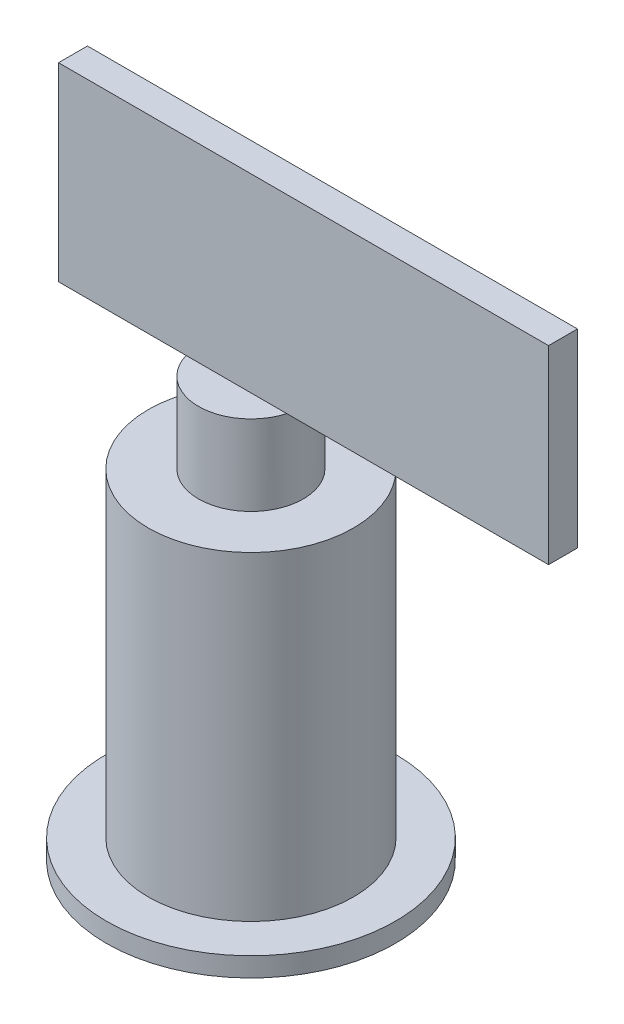
ISO-10303-21;
HEADER;
FILE_DESCRIPTION(('STEP AP214'),'2;1');
FILE_NAME('part.step','',(''),(''),'','','');
FILE_SCHEMA(('AUTOMOTIVE_DESIGN { 1 0 10303 214 1 1 1 1 }'));
ENDSEC;
DATA;
#1=APPLICATION_CONTEXT('core data for automotive mechanical design processes');
#2=APPLICATION_PROTOCOL_DEFINITION('international standard','automotive_design',2000,#1);
#3=PRODUCT_CONTEXT('',#1,'mechanical');
#4=PRODUCT('Part','Part','',(#3));
#5=PRODUCT_RELATED_PRODUCT_CATEGORY('part','',(#4));
#6=PRODUCT_DEFINITION_FORMATION('','',#4);
#7=PRODUCT_DEFINITION_CONTEXT('part definition',#1,'design');
#8=PRODUCT_DEFINITION('design','',#6,#7);
#9=PRODUCT_DEFINITION_SHAPE('','',#8);
#10=(LENGTH_UNIT() NAMED_UNIT(*) SI_UNIT(.MILLI.,.METRE.));
#11=(NAMED_UNIT(*) PLANE_ANGLE_UNIT() SI_UNIT($,.RADIAN.));
#12=(NAMED_UNIT(*) SI_UNIT($,.STERADIAN.) SOLID_ANGLE_UNIT());
#13=UNCERTAINTY_MEASURE_WITH_UNIT(LENGTH_MEASURE(1.E-05),#10,'distance_accuracy_value','');
#14=(GEOMETRIC_REPRESENTATION_CONTEXT(3) GLOBAL_UNCERTAINTY_ASSIGNED_CONTEXT((#13)) GLOBAL_UNIT_ASSIGNED_CONTEXT((#10,
#11,#12)) REPRESENTATION_CONTEXT('',''));
#15=CARTESIAN_POINT('',(0.,0.,0.));
#16=DIRECTION('',(0.,0.,1.));
#17=DIRECTION('',(1.,0.,0.));
#18=AXIS2_PLACEMENT_3D('',#15,#16,#17);
#19=CARTESIAN_POINT('',(0.,8.32,0.));
#20=DIRECTION('',(0.,1.,0.));
#21=DIRECTION('',(0.,0.,1.));
#22=AXIS2_PLACEMENT_3D('',#19,#20,#21);
#23=PLANE('',#22);
#24=CARTESIAN_POINT('',(0.,8.32,0.));
#25=DIRECTION('',(0.,1.,0.));
#26=DIRECTION('',(0.,0.,1.));
#27=AXIS2_PLACEMENT_3D('',#24,#25,#26);
#28=CIRCLE('',#27,5.435);
#29=CARTESIAN_POINT('',(5.2239089770018,8.32,-1.5));
#30=VERTEX_POINT('',#29);
#31=CARTESIAN_POINT('',(-5.2239089770018,8.32,-1.5));
#32=VERTEX_POINT('',#31);
#33=EDGE_CURVE('E164',#30,#32,#28,.T.);
#34=ORIENTED_EDGE('',*,*,#33,.T.);
#35=DIRECTION('',(1.,0.,0.));
#36=VECTOR('',#35,1.);
#37=CARTESIAN_POINT('',(-18.465,8.32,-1.5));
#38=LINE('',#37,#36);
#39=EDGE_CURVE('E55',#32,#30,#38,.T.);
#40=ORIENTED_EDGE('',*,*,#39,.T.);
#41=EDGE_LOOP('',(#34,#40));
#42=FACE_BOUND('',#41,.T.);
#43=ADVANCED_FACE('F45',(#42),#23,.T.);
#44=CARTESIAN_POINT('',(0.,8.32,0.));
#45=DIRECTION('',(0.,-1.,0.));
#46=DIRECTION('',(0.,0.,-1.));
#47=AXIS2_PLACEMENT_3D('',#44,#45,#46);
#48=CYLINDRICAL_SURFACE('',#47,5.435);
#49=CARTESIAN_POINT('',(5.2239089770018,8.32,1.5));
#50=VERTEX_POINT('',#49);
#51=EDGE_CURVE('E162',#50,#30,#28,.T.);
#52=ORIENTED_EDGE('',*,*,#51,.F.);
#53=CARTESIAN_POINT('',(-5.2239089770018,8.32,1.5));
#54=VERTEX_POINT('',#53);
#55=EDGE_CURVE('E156',#54,#50,#28,.T.);
#56=ORIENTED_EDGE('',*,*,#55,.F.);
#57=EDGE_CURVE('E117',#32,#54,#28,.T.);
#58=ORIENTED_EDGE('',*,*,#57,.F.);
#59=ORIENTED_EDGE('',*,*,#33,.F.);
#60=EDGE_LOOP('',(#52,#56,#58,#59));
#61=FACE_BOUND('',#60,.T.);
#62=CARTESIAN_POINT('',(0.,0.,0.));
#63=DIRECTION('',(0.,1.,0.));
#64=DIRECTION('',(0.,0.,1.));
#65=AXIS2_PLACEMENT_3D('',#62,#63,#64);
#66=CIRCLE('',#65,5.435);
#67=CARTESIAN_POINT('',(0.,0.,5.435));
#68=VERTEX_POINT('',#67);
#69=EDGE_CURVE('E49',#68,#68,#66,.T.);
#70=ORIENTED_EDGE('',*,*,#69,.T.);
#71=EDGE_LOOP('',(#70));
#72=FACE_BOUND('',#71,.T.);
#73=ADVANCED_FACE('F47',(#61,#72),#48,.T.);
#74=DIRECTION('',(1.,0.,0.));
#75=VECTOR('',#74,1.);
#76=CARTESIAN_POINT('',(-18.465,8.32,1.5));
#77=LINE('',#76,#75);
#78=EDGE_CURVE('E11',#54,#50,#77,.T.);
#79=ORIENTED_EDGE('',*,*,#78,.F.);
#80=ORIENTED_EDGE('',*,*,#55,.T.);
#81=EDGE_LOOP('',(#79,#80));
#82=FACE_BOUND('',#81,.T.);
#83=ADVANCED_FACE('F175',(#82),#23,.T.);
#84=CARTESIAN_POINT('',(-18.465,8.32,-1.5));
#85=DIRECTION('',(0.,-1.,0.));
#86=DIRECTION('',(0.,0.,-1.));
#87=AXIS2_PLACEMENT_3D('',#84,#85,#86);
#88=PLANE('',#87);
#89=CARTESIAN_POINT('',(32.385,8.32,1.5));
#90=VERTEX_POINT('',#89);
#91=EDGE_CURVE('E58',#50,#90,#77,.T.);
#92=ORIENTED_EDGE('',*,*,#91,.F.);
#93=ORIENTED_EDGE('',*,*,#51,.T.);
#94=CARTESIAN_POINT('',(32.385,8.32,-1.5));
#95=VERTEX_POINT('',#94);
#96=EDGE_CURVE('E65',#30,#95,#38,.T.);
#97=ORIENTED_EDGE('',*,*,#96,.T.);
#98=DIRECTION('',(0.,0.,1.));
#99=VECTOR('',#98,1.);
#100=CARTESIAN_POINT('',(32.385,8.32,-1.5));
#101=LINE('',#100,#99);
#102=EDGE_CURVE('E111',#95,#90,#101,.T.);
#103=ORIENTED_EDGE('',*,*,#102,.T.);
#104=EDGE_LOOP('',(#92,#93,#97,#103));
#105=FACE_BOUND('',#104,.T.);
#106=ADVANCED_FACE('F186',(#105),#88,.T.);
#107=CARTESIAN_POINT('',(-18.465,28.01,-1.5));
#108=DIRECTION('',(-1.,0.,0.));
#109=DIRECTION('',(0.,-1.,0.));
#110=AXIS2_PLACEMENT_3D('',#107,#108,#109);
#111=PLANE('',#110);
#112=DIRECTION('',(0.,0.,1.));
#113=VECTOR('',#112,1.);
#114=CARTESIAN_POINT('',(-18.465,8.32,-1.5));
#115=LINE('',#114,#113);
#116=CARTESIAN_POINT('',(-18.465,8.32,-1.5));
#117=VERTEX_POINT('',#116);
#118=CARTESIAN_POINT('',(-18.465,8.32,1.5));
#119=VERTEX_POINT('',#118);
#120=EDGE_CURVE('E102',#117,#119,#115,.T.);
#121=ORIENTED_EDGE('',*,*,#120,.T.);
#122=DIRECTION('',(0.,-1.,0.));
#123=VECTOR('',#122,1.);
#124=CARTESIAN_POINT('',(-18.465,28.01,1.5));
#125=LINE('',#124,#123);
#126=CARTESIAN_POINT('',(-18.465,28.01,1.5));
#127=VERTEX_POINT('',#126);
#128=EDGE_CURVE('E106',#127,#119,#125,.T.);
#129=ORIENTED_EDGE('',*,*,#128,.F.);
#130=DIRECTION('',(0.,0.,1.));
#131=VECTOR('',#130,1.);
#132=CARTESIAN_POINT('',(-18.465,28.01,-1.5));
#133=LINE('',#132,#131);
#134=CARTESIAN_POINT('',(-18.465,28.01,-1.5));
#135=VERTEX_POINT('',#134);
#136=EDGE_CURVE('E153',#135,#127,#133,.T.);
#137=ORIENTED_EDGE('',*,*,#136,.F.);
#138=DIRECTION('',(0.,-1.,0.));
#139=VECTOR('',#138,1.);
#140=CARTESIAN_POINT('',(-18.465,28.01,-1.5));
#141=LINE('',#140,#139);
#142=EDGE_CURVE('E108',#135,#117,#141,.T.);
#143=ORIENTED_EDGE('',*,*,#142,.T.);
#144=EDGE_LOOP('',(#121,#129,#137,#143));
#145=FACE_BOUND('',#144,.T.);
#146=ADVANCED_FACE('F104',(#145),#111,.T.);
#147=CARTESIAN_POINT('',(-18.465,28.01,-1.5));
#148=DIRECTION('',(0.,1.,0.));
#149=DIRECTION('',(-1.,0.,0.));
#150=AXIS2_PLACEMENT_3D('',#147,#148,#149);
#151=PLANE('',#150);
#152=ORIENTED_EDGE('',*,*,#136,.T.);
#153=DIRECTION('',(-1.,0.,0.));
#154=VECTOR('',#153,1.);
#155=CARTESIAN_POINT('',(-18.465,28.01,1.5));
#156=LINE('',#155,#154);
#157=CARTESIAN_POINT('',(32.385,28.01,1.5));
#158=VERTEX_POINT('',#157);
#159=EDGE_CURVE('E126',#158,#127,#156,.T.);
#160=ORIENTED_EDGE('',*,*,#159,.F.);
#161=DIRECTION('',(0.,0.,1.));
#162=VECTOR('',#161,1.);
#163=CARTESIAN_POINT('',(32.385,28.01,-1.5));
#164=LINE('',#163,#162);
#165=CARTESIAN_POINT('',(32.385,28.01,-1.5));
#166=VERTEX_POINT('',#165);
#167=EDGE_CURVE('E157',#166,#158,#164,.T.);
#168=ORIENTED_EDGE('',*,*,#167,.F.);
#169=DIRECTION('',(-1.,0.,0.));
#170=VECTOR('',#169,1.);
#171=CARTESIAN_POINT('',(-18.465,28.01,-1.5));
#172=LINE('',#171,#170);
#173=EDGE_CURVE('E112',#166,#135,#172,.T.);
#174=ORIENTED_EDGE('',*,*,#173,.T.);
#175=EDGE_LOOP('',(#152,#160,#168,#174));
#176=FACE_BOUND('',#175,.T.);
#177=ADVANCED_FACE('F194',(#176),#151,.T.);
#178=CARTESIAN_POINT('',(32.385,28.01,-1.5));
#179=DIRECTION('',(1.,0.,0.));
#180=DIRECTION('',(0.,1.,0.));
#181=AXIS2_PLACEMENT_3D('',#178,#179,#180);
#182=PLANE('',#181);
#183=ORIENTED_EDGE('',*,*,#167,.T.);
#184=DIRECTION('',(0.,1.,0.));
#185=VECTOR('',#184,1.);
#186=CARTESIAN_POINT('',(32.385,28.01,1.5));
#187=LINE('',#186,#185);
#188=EDGE_CURVE('E121',#90,#158,#187,.T.);
#189=ORIENTED_EDGE('',*,*,#188,.F.);
#190=ORIENTED_EDGE('',*,*,#102,.F.);
#191=DIRECTION('',(0.,1.,0.));
#192=VECTOR('',#191,1.);
#193=CARTESIAN_POINT('',(32.385,28.01,-1.5));
#194=LINE('',#193,#192);
#195=EDGE_CURVE('E146',#95,#166,#194,.T.);
#196=ORIENTED_EDGE('',*,*,#195,.T.);
#197=EDGE_LOOP('',(#183,#189,#190,#196));
#198=FACE_BOUND('',#197,.T.);
#199=ADVANCED_FACE('F198',(#198),#182,.T.);
#200=EDGE_CURVE('E143',#117,#32,#38,.T.);
#201=ORIENTED_EDGE('',*,*,#200,.T.);
#202=ORIENTED_EDGE('',*,*,#57,.T.);
#203=EDGE_CURVE('E57',#119,#54,#77,.T.);
#204=ORIENTED_EDGE('',*,*,#203,.F.);
#205=ORIENTED_EDGE('',*,*,#120,.F.);
#206=EDGE_LOOP('',(#201,#202,#204,#205));
#207=FACE_BOUND('',#206,.T.);
#208=ADVANCED_FACE('F115',(#207),#88,.T.);
#209=CARTESIAN_POINT('',(0.,0.,-1.5));
#210=DIRECTION('',(0.,0.,1.));
#211=DIRECTION('',(1.,0.,0.));
#212=AXIS2_PLACEMENT_3D('',#209,#210,#211);
#213=PLANE('',#212);
#214=ORIENTED_EDGE('',*,*,#142,.F.);
#215=ORIENTED_EDGE('',*,*,#173,.F.);
#216=ORIENTED_EDGE('',*,*,#195,.F.);
#217=ORIENTED_EDGE('',*,*,#96,.F.);
#218=ORIENTED_EDGE('',*,*,#39,.F.);
#219=ORIENTED_EDGE('',*,*,#200,.F.);
#220=EDGE_LOOP('',(#214,#215,#216,#217,#218,#219));
#221=FACE_BOUND('',#220,.T.);
#222=ADVANCED_FACE('F197',(#221),#213,.F.);
#223=CARTESIAN_POINT('',(0.,0.,1.5));
#224=DIRECTION('',(0.,0.,1.));
#225=DIRECTION('',(1.,0.,0.));
#226=AXIS2_PLACEMENT_3D('',#223,#224,#225);
#227=PLANE('',#226);
#228=ORIENTED_EDGE('',*,*,#128,.T.);
#229=ORIENTED_EDGE('',*,*,#203,.T.);
#230=ORIENTED_EDGE('',*,*,#78,.T.);
#231=ORIENTED_EDGE('',*,*,#91,.T.);
#232=ORIENTED_EDGE('',*,*,#188,.T.);
#233=ORIENTED_EDGE('',*,*,#159,.T.);
#234=EDGE_LOOP('',(#228,#229,#230,#231,#232,#233));
#235=FACE_BOUND('',#234,.T.);
#236=ADVANCED_FACE('F123',(#235),#227,.T.);
#237=CARTESIAN_POINT('',(0.,-33.16,0.));
#238=DIRECTION('',(0.,1.,0.));
#239=DIRECTION('',(0.,0.,1.));
#240=AXIS2_PLACEMENT_3D('',#237,#238,#239);
#241=CYLINDRICAL_SURFACE('',#240,10.65);
#242=CARTESIAN_POINT('',(0.,-33.16,0.));
#243=DIRECTION('',(0.,-1.,0.));
#244=DIRECTION('',(0.,0.,-1.));
#245=AXIS2_PLACEMENT_3D('',#242,#243,#244);
#246=CIRCLE('',#245,10.65);
#247=CARTESIAN_POINT('',(0.,-33.16,-10.65));
#248=VERTEX_POINT('',#247);
#249=EDGE_CURVE('E132',#248,#248,#246,.T.);
#250=ORIENTED_EDGE('',*,*,#249,.F.);
#251=EDGE_LOOP('',(#250));
#252=FACE_BOUND('',#251,.T.);
#253=CARTESIAN_POINT('',(0.,0.,0.));
#254=DIRECTION('',(0.,-1.,0.));
#255=DIRECTION('',(0.,0.,-1.));
#256=AXIS2_PLACEMENT_3D('',#253,#254,#255);
#257=CIRCLE('',#256,10.65);
#258=CARTESIAN_POINT('',(0.,0.,-10.65));
#259=VERTEX_POINT('',#258);
#260=EDGE_CURVE('E134',#259,#259,#257,.T.);
#261=ORIENTED_EDGE('',*,*,#260,.T.);
#262=EDGE_LOOP('',(#261));
#263=FACE_BOUND('',#262,.T.);
#264=ADVANCED_FACE('F213',(#252,#263),#241,.T.);
#265=CARTESIAN_POINT('',(0.,0.,0.));
#266=DIRECTION('',(0.,-1.,0.));
#267=DIRECTION('',(0.,0.,-1.));
#268=AXIS2_PLACEMENT_3D('',#265,#266,#267);
#269=PLANE('',#268);
#270=ORIENTED_EDGE('',*,*,#69,.F.);
#271=EDGE_LOOP('',(#270));
#272=FACE_BOUND('',#271,.T.);
#273=ORIENTED_EDGE('',*,*,#260,.F.);
#274=EDGE_LOOP('',(#273));
#275=FACE_BOUND('',#274,.T.);
#276=ADVANCED_FACE('F216',(#272,#275),#269,.F.);
#277=CARTESIAN_POINT('',(0.,-35.16,0.));
#278=DIRECTION('',(0.,1.,0.));
#279=DIRECTION('',(0.,0.,1.));
#280=AXIS2_PLACEMENT_3D('',#277,#278,#279);
#281=CYLINDRICAL_SURFACE('',#280,15.);
#282=CARTESIAN_POINT('',(0.,-35.16,0.));
#283=DIRECTION('',(0.,-1.,0.));
#284=DIRECTION('',(0.,0.,-1.));
#285=AXIS2_PLACEMENT_3D('',#282,#283,#284);
#286=CIRCLE('',#285,15.);
#287=CARTESIAN_POINT('',(0.,-35.16,-15.));
#288=VERTEX_POINT('',#287);
#289=EDGE_CURVE('E236',#288,#288,#286,.T.);
#290=ORIENTED_EDGE('',*,*,#289,.F.);
#291=EDGE_LOOP('',(#290));
#292=FACE_BOUND('',#291,.T.);
#293=CARTESIAN_POINT('',(0.,-33.16,0.));
#294=DIRECTION('',(0.,-1.,0.));
#295=DIRECTION('',(0.,0.,-1.));
#296=AXIS2_PLACEMENT_3D('',#293,#294,#295);
#297=CIRCLE('',#296,15.);
#298=CARTESIAN_POINT('',(0.,-33.16,-15.));
#299=VERTEX_POINT('',#298);
#300=EDGE_CURVE('E238',#299,#299,#297,.T.);
#301=ORIENTED_EDGE('',*,*,#300,.T.);
#302=EDGE_LOOP('',(#301));
#303=FACE_BOUND('',#302,.T.);
#304=ADVANCED_FACE('F220',(#292,#303),#281,.T.);
#305=CARTESIAN_POINT('',(0.,-35.16,0.));
#306=DIRECTION('',(0.,-1.,0.));
#307=DIRECTION('',(0.,0.,-1.));
#308=AXIS2_PLACEMENT_3D('',#305,#306,#307);
#309=PLANE('',#308);
#310=ORIENTED_EDGE('',*,*,#289,.T.);
#311=EDGE_LOOP('',(#310));
#312=FACE_BOUND('',#311,.T.);
#313=ADVANCED_FACE('F224',(#312),#309,.T.);
#314=CARTESIAN_POINT('',(0.,-33.16,0.));
#315=DIRECTION('',(0.,-1.,0.));
#316=DIRECTION('',(0.,0.,-1.));
#317=AXIS2_PLACEMENT_3D('',#314,#315,#316);
#318=PLANE('',#317);
#319=ORIENTED_EDGE('',*,*,#249,.T.);
#320=EDGE_LOOP('',(#319));
#321=FACE_BOUND('',#320,.T.);
#322=ORIENTED_EDGE('',*,*,#300,.F.);
#323=EDGE_LOOP('',(#322));
#324=FACE_BOUND('',#323,.T.);
#325=ADVANCED_FACE('F226',(#321,#324),#318,.F.);
#326=CLOSED_SHELL('',(#43,#73,#83,#106,#146,#177,#199,#208,#222,#236,#264,#276,#304,#313,#325));
#327=MANIFOLD_SOLID_BREP('B2',#326);
#328=ADVANCED_BREP_SHAPE_REPRESENTATION('',(#18,#327),#14);
#329=SHAPE_DEFINITION_REPRESENTATION(#9,#328);
ENDSEC;
END-ISO-10303-21;
